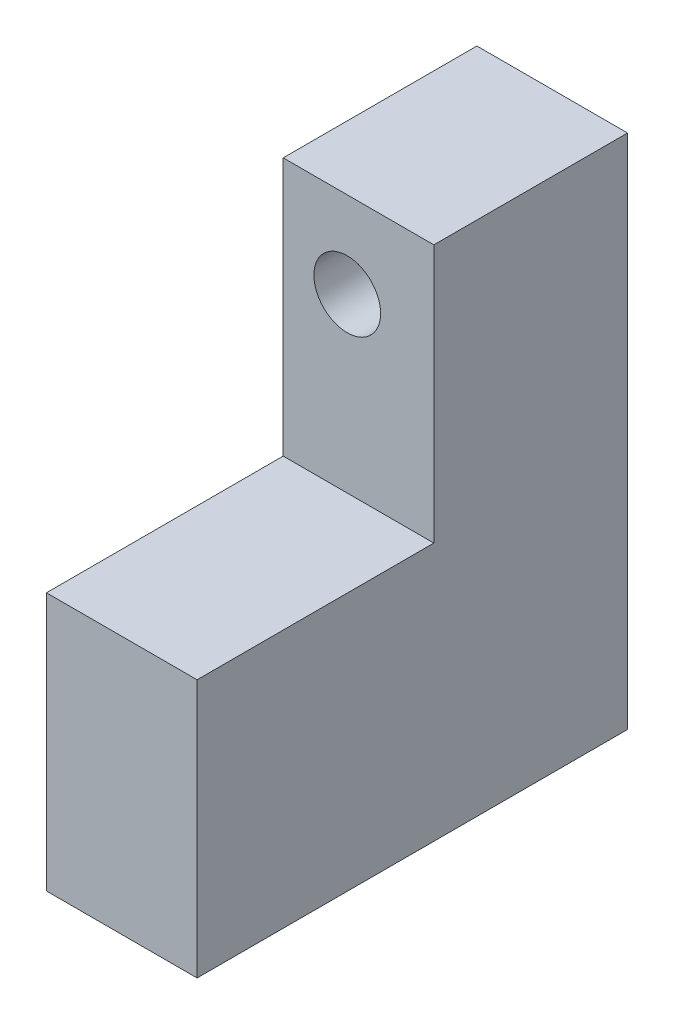
ISO-10303-21;
HEADER;
FILE_DESCRIPTION(('STEP AP214'),'2;1');
FILE_NAME('part.step','',(''),(''),'','','');
FILE_SCHEMA(('AUTOMOTIVE_DESIGN { 1 0 10303 214 1 1 1 1 }'));
ENDSEC;
DATA;
#1=APPLICATION_CONTEXT('core data for automotive mechanical design processes');
#2=APPLICATION_PROTOCOL_DEFINITION('international standard','automotive_design',2000,#1);
#3=PRODUCT_CONTEXT('',#1,'mechanical');
#4=PRODUCT('Part','Part','',(#3));
#5=PRODUCT_RELATED_PRODUCT_CATEGORY('part','',(#4));
#6=PRODUCT_DEFINITION_FORMATION('','',#4);
#7=PRODUCT_DEFINITION_CONTEXT('part definition',#1,'design');
#8=PRODUCT_DEFINITION('design','',#6,#7);
#9=PRODUCT_DEFINITION_SHAPE('','',#8);
#10=(LENGTH_UNIT() NAMED_UNIT(*) SI_UNIT(.MILLI.,.METRE.));
#11=(NAMED_UNIT(*) PLANE_ANGLE_UNIT() SI_UNIT($,.RADIAN.));
#12=(NAMED_UNIT(*) SI_UNIT($,.STERADIAN.) SOLID_ANGLE_UNIT());
#13=UNCERTAINTY_MEASURE_WITH_UNIT(LENGTH_MEASURE(1.E-05),#10,'distance_accuracy_value','');
#14=(GEOMETRIC_REPRESENTATION_CONTEXT(3) GLOBAL_UNCERTAINTY_ASSIGNED_CONTEXT((#13)) GLOBAL_UNIT_ASSIGNED_CONTEXT((#10,
#11,#12)) REPRESENTATION_CONTEXT('',''));
#15=CARTESIAN_POINT('',(0.,0.,0.));
#16=DIRECTION('',(0.,0.,1.));
#17=DIRECTION('',(1.,0.,0.));
#18=AXIS2_PLACEMENT_3D('',#15,#16,#17);
#19=CARTESIAN_POINT('',(0.,0.,9.));
#20=DIRECTION('',(0.,0.,-1.));
#21=DIRECTION('',(-1.,0.,0.));
#22=AXIS2_PLACEMENT_3D('',#19,#20,#21);
#23=PLANE('',#22);
#24=DIRECTION('',(0.,-1.,0.));
#25=VECTOR('',#24,1.);
#26=CARTESIAN_POINT('',(0.0250628144668974,28.5,9.));
#27=LINE('',#26,#25);
#28=CARTESIAN_POINT('',(0.0250628144668974,28.5,9.));
#29=VERTEX_POINT('',#28);
#30=CARTESIAN_POINT('',(0.0250628144668989,16.5,9.));
#31=VERTEX_POINT('',#30);
#32=EDGE_CURVE('E105',#29,#31,#27,.T.);
#33=ORIENTED_EDGE('',*,*,#32,.T.);
#34=DIRECTION('',(1.,0.,0.));
#35=VECTOR('',#34,1.);
#36=CARTESIAN_POINT('',(0.0250628144668989,16.5,9.));
#37=LINE('',#36,#35);
#38=CARTESIAN_POINT('',(7.0250628144669,16.5,9.));
#39=VERTEX_POINT('',#38);
#40=EDGE_CURVE('E137',#31,#39,#37,.T.);
#41=ORIENTED_EDGE('',*,*,#40,.T.);
#42=DIRECTION('',(0.,1.,0.));
#43=VECTOR('',#42,1.);
#44=CARTESIAN_POINT('',(7.0250628144669,28.5,9.));
#45=LINE('',#44,#43);
#46=CARTESIAN_POINT('',(7.0250628144669,28.5,9.));
#47=VERTEX_POINT('',#46);
#48=EDGE_CURVE('E95',#39,#47,#45,.T.);
#49=ORIENTED_EDGE('',*,*,#48,.T.);
#50=DIRECTION('',(-1.,0.,0.));
#51=VECTOR('',#50,1.);
#52=CARTESIAN_POINT('',(7.0250628144669,28.5,9.));
#53=LINE('',#52,#51);
#54=EDGE_CURVE('E63',#47,#29,#53,.T.);
#55=ORIENTED_EDGE('',*,*,#54,.T.);
#56=EDGE_LOOP('',(#33,#41,#49,#55));
#57=FACE_BOUND('',#56,.T.);
#58=CARTESIAN_POINT('',(3.,24.5,9.));
#59=DIRECTION('',(0.,0.,1.));
#60=DIRECTION('',(1.,0.,0.));
#61=AXIS2_PLACEMENT_3D('',#58,#59,#60);
#62=CIRCLE('',#61,1.55);
#63=CARTESIAN_POINT('',(4.55,24.5,9.));
#64=VERTEX_POINT('',#63);
#65=EDGE_CURVE('E110',#64,#64,#62,.T.);
#66=ORIENTED_EDGE('',*,*,#65,.F.);
#67=EDGE_LOOP('',(#66));
#68=FACE_BOUND('',#67,.T.);
#69=ADVANCED_FACE('F39',(#57,#68),#23,.F.);
#70=CARTESIAN_POINT('',(0.,0.,0.));
#71=DIRECTION('',(0.,0.,-1.));
#72=DIRECTION('',(-1.,0.,0.));
#73=AXIS2_PLACEMENT_3D('',#70,#71,#72);
#74=PLANE('',#73);
#75=DIRECTION('',(0.,1.,0.));
#76=VECTOR('',#75,1.);
#77=CARTESIAN_POINT('',(7.0250628144669,28.5,0.));
#78=LINE('',#77,#76);
#79=CARTESIAN_POINT('',(7.0250628144669,4.5,0.));
#80=VERTEX_POINT('',#79);
#81=CARTESIAN_POINT('',(7.0250628144669,28.5,0.));
#82=VERTEX_POINT('',#81);
#83=EDGE_CURVE('E102',#80,#82,#78,.T.);
#84=ORIENTED_EDGE('',*,*,#83,.F.);
#85=DIRECTION('',(1.,0.,0.));
#86=VECTOR('',#85,1.);
#87=CARTESIAN_POINT('',(7.0250628144669,4.5,0.));
#88=LINE('',#87,#86);
#89=CARTESIAN_POINT('',(0.0250628144669004,4.5,0.));
#90=VERTEX_POINT('',#89);
#91=EDGE_CURVE('E83',#90,#80,#88,.T.);
#92=ORIENTED_EDGE('',*,*,#91,.F.);
#93=DIRECTION('',(0.,-1.,0.));
#94=VECTOR('',#93,1.);
#95=CARTESIAN_POINT('',(0.0250628144668974,28.5,0.));
#96=LINE('',#95,#94);
#97=CARTESIAN_POINT('',(0.0250628144668974,28.5,0.));
#98=VERTEX_POINT('',#97);
#99=EDGE_CURVE('E96',#98,#90,#96,.T.);
#100=ORIENTED_EDGE('',*,*,#99,.F.);
#101=DIRECTION('',(-1.,0.,0.));
#102=VECTOR('',#101,1.);
#103=CARTESIAN_POINT('',(7.0250628144669,28.5,0.));
#104=LINE('',#103,#102);
#105=EDGE_CURVE('E109',#82,#98,#104,.T.);
#106=ORIENTED_EDGE('',*,*,#105,.F.);
#107=EDGE_LOOP('',(#84,#92,#100,#106));
#108=FACE_BOUND('',#107,.T.);
#109=CARTESIAN_POINT('',(3.,24.5,0.));
#110=DIRECTION('',(0.,0.,1.));
#111=DIRECTION('',(1.,0.,0.));
#112=AXIS2_PLACEMENT_3D('',#109,#110,#111);
#113=CIRCLE('',#112,1.55);
#114=CARTESIAN_POINT('',(4.55,24.5,0.));
#115=VERTEX_POINT('',#114);
#116=EDGE_CURVE('E114',#115,#115,#113,.T.);
#117=ORIENTED_EDGE('',*,*,#116,.T.);
#118=EDGE_LOOP('',(#117));
#119=FACE_BOUND('',#118,.T.);
#120=ADVANCED_FACE('F107',(#108,#119),#74,.T.);
#121=CARTESIAN_POINT('',(7.0250628144669,28.5,9.));
#122=DIRECTION('',(-1.,0.,0.));
#123=DIRECTION('',(0.,-1.,0.));
#124=AXIS2_PLACEMENT_3D('',#121,#122,#123);
#125=PLANE('',#124);
#126=ORIENTED_EDGE('',*,*,#83,.T.);
#127=DIRECTION('',(0.,0.,-1.));
#128=VECTOR('',#127,1.);
#129=CARTESIAN_POINT('',(7.0250628144669,28.5,9.));
#130=LINE('',#129,#128);
#131=EDGE_CURVE('E11',#47,#82,#130,.T.);
#132=ORIENTED_EDGE('',*,*,#131,.F.);
#133=ORIENTED_EDGE('',*,*,#48,.F.);
#134=DIRECTION('',(0.,0.,-1.));
#135=VECTOR('',#134,1.);
#136=CARTESIAN_POINT('',(7.0250628144669,16.5,20.));
#137=LINE('',#136,#135);
#138=CARTESIAN_POINT('',(7.0250628144669,16.5,20.));
#139=VERTEX_POINT('',#138);
#140=EDGE_CURVE('E54',#139,#39,#137,.T.);
#141=ORIENTED_EDGE('',*,*,#140,.F.);
#142=DIRECTION('',(0.,-1.,0.));
#143=VECTOR('',#142,1.);
#144=CARTESIAN_POINT('',(7.0250628144669,16.5,20.));
#145=LINE('',#144,#143);
#146=CARTESIAN_POINT('',(7.0250628144669,4.5,20.));
#147=VERTEX_POINT('',#146);
#148=EDGE_CURVE('E104',#139,#147,#145,.T.);
#149=ORIENTED_EDGE('',*,*,#148,.T.);
#150=DIRECTION('',(0.,0.,-1.));
#151=VECTOR('',#150,1.);
#152=CARTESIAN_POINT('',(7.0250628144669,4.5,9.));
#153=LINE('',#152,#151);
#154=EDGE_CURVE('E88',#147,#80,#153,.T.);
#155=ORIENTED_EDGE('',*,*,#154,.T.);
#156=EDGE_LOOP('',(#126,#132,#133,#141,#149,#155));
#157=FACE_BOUND('',#156,.T.);
#158=ADVANCED_FACE('F41',(#157),#125,.F.);
#159=CARTESIAN_POINT('',(7.0250628144669,28.5,9.));
#160=DIRECTION('',(0.,-1.,0.));
#161=DIRECTION('',(1.,0.,0.));
#162=AXIS2_PLACEMENT_3D('',#159,#160,#161);
#163=PLANE('',#162);
#164=ORIENTED_EDGE('',*,*,#105,.T.);
#165=DIRECTION('',(0.,0.,-1.));
#166=VECTOR('',#165,1.);
#167=CARTESIAN_POINT('',(0.0250628144668974,28.5,9.));
#168=LINE('',#167,#166);
#169=EDGE_CURVE('E47',#29,#98,#168,.T.);
#170=ORIENTED_EDGE('',*,*,#169,.F.);
#171=ORIENTED_EDGE('',*,*,#54,.F.);
#172=ORIENTED_EDGE('',*,*,#131,.T.);
#173=EDGE_LOOP('',(#164,#170,#171,#172));
#174=FACE_BOUND('',#173,.T.);
#175=ADVANCED_FACE('F126',(#174),#163,.F.);
#176=CARTESIAN_POINT('',(0.0250628144668974,28.5,9.));
#177=DIRECTION('',(1.,0.,0.));
#178=DIRECTION('',(0.,1.,0.));
#179=AXIS2_PLACEMENT_3D('',#176,#177,#178);
#180=PLANE('',#179);
#181=ORIENTED_EDGE('',*,*,#99,.T.);
#182=DIRECTION('',(0.,0.,-1.));
#183=VECTOR('',#182,1.);
#184=CARTESIAN_POINT('',(0.0250628144669004,4.5,9.));
#185=LINE('',#184,#183);
#186=CARTESIAN_POINT('',(0.0250628144668989,4.5,20.));
#187=VERTEX_POINT('',#186);
#188=EDGE_CURVE('E91',#187,#90,#185,.T.);
#189=ORIENTED_EDGE('',*,*,#188,.F.);
#190=DIRECTION('',(0.,-1.,0.));
#191=VECTOR('',#190,1.);
#192=CARTESIAN_POINT('',(0.0250628144668989,16.5,20.));
#193=LINE('',#192,#191);
#194=CARTESIAN_POINT('',(0.0250628144668989,16.5,20.));
#195=VERTEX_POINT('',#194);
#196=EDGE_CURVE('E136',#195,#187,#193,.T.);
#197=ORIENTED_EDGE('',*,*,#196,.F.);
#198=DIRECTION('',(0.,0.,-1.));
#199=VECTOR('',#198,1.);
#200=CARTESIAN_POINT('',(0.0250628144668989,16.5,20.));
#201=LINE('',#200,#199);
#202=EDGE_CURVE('E134',#195,#31,#201,.T.);
#203=ORIENTED_EDGE('',*,*,#202,.T.);
#204=ORIENTED_EDGE('',*,*,#32,.F.);
#205=ORIENTED_EDGE('',*,*,#169,.T.);
#206=EDGE_LOOP('',(#181,#189,#197,#203,#204,#205));
#207=FACE_BOUND('',#206,.T.);
#208=ADVANCED_FACE('F123',(#207),#180,.F.);
#209=CARTESIAN_POINT('',(7.0250628144669,4.5,9.));
#210=DIRECTION('',(0.,1.,0.));
#211=DIRECTION('',(-1.,0.,0.));
#212=AXIS2_PLACEMENT_3D('',#209,#210,#211);
#213=PLANE('',#212);
#214=CARTESIAN_POINT('',(3.5250628144669,4.5,5.));
#215=DIRECTION('',(0.,-1.,0.));
#216=DIRECTION('',(1.,0.,0.));
#217=AXIS2_PLACEMENT_3D('',#214,#215,#216);
#218=CIRCLE('',#217,1.55);
#219=CARTESIAN_POINT('',(5.0750628144669,4.5,5.));
#220=VERTEX_POINT('',#219);
#221=EDGE_CURVE('E153',#220,#220,#218,.T.);
#222=ORIENTED_EDGE('',*,*,#221,.F.);
#223=EDGE_LOOP('',(#222));
#224=FACE_BOUND('',#223,.T.);
#225=CARTESIAN_POINT('',(3.5250628144669,4.5,15.));
#226=DIRECTION('',(0.,-1.,0.));
#227=DIRECTION('',(1.,0.,0.));
#228=AXIS2_PLACEMENT_3D('',#225,#226,#227);
#229=CIRCLE('',#228,1.55);
#230=CARTESIAN_POINT('',(5.0750628144669,4.5,15.));
#231=VERTEX_POINT('',#230);
#232=EDGE_CURVE('E150',#231,#231,#229,.T.);
#233=ORIENTED_EDGE('',*,*,#232,.F.);
#234=EDGE_LOOP('',(#233));
#235=FACE_BOUND('',#234,.T.);
#236=ORIENTED_EDGE('',*,*,#91,.T.);
#237=ORIENTED_EDGE('',*,*,#154,.F.);
#238=DIRECTION('',(1.,0.,0.));
#239=VECTOR('',#238,1.);
#240=CARTESIAN_POINT('',(0.0250628144668989,4.5,20.));
#241=LINE('',#240,#239);
#242=EDGE_CURVE('E139',#187,#147,#241,.T.);
#243=ORIENTED_EDGE('',*,*,#242,.F.);
#244=ORIENTED_EDGE('',*,*,#188,.T.);
#245=EDGE_LOOP('',(#236,#237,#243,#244));
#246=FACE_BOUND('',#245,.T.);
#247=ADVANCED_FACE('F85',(#224,#235,#246),#213,.F.);
#248=CARTESIAN_POINT('',(3.,24.5,9.));
#249=DIRECTION('',(0.,0.,-1.));
#250=DIRECTION('',(-1.,0.,0.));
#251=AXIS2_PLACEMENT_3D('',#248,#249,#250);
#252=CYLINDRICAL_SURFACE('',#251,1.55);
#253=ORIENTED_EDGE('',*,*,#65,.T.);
#254=EDGE_LOOP('',(#253));
#255=FACE_BOUND('',#254,.T.);
#256=ORIENTED_EDGE('',*,*,#116,.F.);
#257=EDGE_LOOP('',(#256));
#258=FACE_BOUND('',#257,.T.);
#259=ADVANCED_FACE('F170',(#255,#258),#252,.F.);
#260=CARTESIAN_POINT('',(0.0250628144668989,16.5,20.));
#261=DIRECTION('',(0.,1.,0.));
#262=DIRECTION('',(-1.,0.,0.));
#263=AXIS2_PLACEMENT_3D('',#260,#261,#262);
#264=PLANE('',#263);
#265=ORIENTED_EDGE('',*,*,#40,.F.);
#266=ORIENTED_EDGE('',*,*,#202,.F.);
#267=DIRECTION('',(1.,0.,0.));
#268=VECTOR('',#267,1.);
#269=CARTESIAN_POINT('',(0.0250628144668989,16.5,20.));
#270=LINE('',#269,#268);
#271=EDGE_CURVE('E143',#195,#139,#270,.T.);
#272=ORIENTED_EDGE('',*,*,#271,.T.);
#273=ORIENTED_EDGE('',*,*,#140,.T.);
#274=EDGE_LOOP('',(#265,#266,#272,#273));
#275=FACE_BOUND('',#274,.T.);
#276=ADVANCED_FACE('F185',(#275),#264,.T.);
#277=CARTESIAN_POINT('',(0.,0.,20.));
#278=DIRECTION('',(0.,0.,-1.));
#279=DIRECTION('',(-1.,0.,0.));
#280=AXIS2_PLACEMENT_3D('',#277,#278,#279);
#281=PLANE('',#280);
#282=ORIENTED_EDGE('',*,*,#242,.T.);
#283=ORIENTED_EDGE('',*,*,#148,.F.);
#284=ORIENTED_EDGE('',*,*,#271,.F.);
#285=ORIENTED_EDGE('',*,*,#196,.T.);
#286=EDGE_LOOP('',(#282,#283,#284,#285));
#287=FACE_BOUND('',#286,.T.);
#288=ADVANCED_FACE('F176',(#287),#281,.F.);
#289=CARTESIAN_POINT('',(3.5250628144669,9.5,15.));
#290=DIRECTION('',(0.,-1.,0.));
#291=DIRECTION('',(1.,0.,0.));
#292=AXIS2_PLACEMENT_3D('',#289,#290,#291);
#293=CYLINDRICAL_SURFACE('',#292,1.55);
#294=CARTESIAN_POINT('',(3.5250628144669,9.5,15.));
#295=DIRECTION('',(0.,-1.,0.));
#296=DIRECTION('',(1.,0.,0.));
#297=AXIS2_PLACEMENT_3D('',#294,#295,#296);
#298=CIRCLE('',#297,1.55);
#299=CARTESIAN_POINT('',(5.0750628144669,9.5,15.));
#300=VERTEX_POINT('',#299);
#301=EDGE_CURVE('E147',#300,#300,#298,.T.);
#302=ORIENTED_EDGE('',*,*,#301,.F.);
#303=EDGE_LOOP('',(#302));
#304=FACE_BOUND('',#303,.T.);
#305=ORIENTED_EDGE('',*,*,#232,.T.);
#306=EDGE_LOOP('',(#305));
#307=FACE_BOUND('',#306,.T.);
#308=ADVANCED_FACE('F174',(#304,#307),#293,.F.);
#309=CARTESIAN_POINT('',(3.5250628144669,9.5,15.));
#310=DIRECTION('',(0.,-1.,0.));
#311=DIRECTION('',(1.,0.,0.));
#312=AXIS2_PLACEMENT_3D('',#309,#310,#311);
#313=PLANE('',#312);
#314=ORIENTED_EDGE('',*,*,#301,.T.);
#315=EDGE_LOOP('',(#314));
#316=FACE_BOUND('',#315,.T.);
#317=ADVANCED_FACE('F164',(#316),#313,.T.);
#318=CARTESIAN_POINT('',(3.5250628144669,9.5,5.));
#319=DIRECTION('',(0.,-1.,0.));
#320=DIRECTION('',(1.,0.,0.));
#321=AXIS2_PLACEMENT_3D('',#318,#319,#320);
#322=CYLINDRICAL_SURFACE('',#321,1.55);
#323=CARTESIAN_POINT('',(3.5250628144669,9.5,5.));
#324=DIRECTION('',(0.,-1.,0.));
#325=DIRECTION('',(1.,0.,0.));
#326=AXIS2_PLACEMENT_3D('',#323,#324,#325);
#327=CIRCLE('',#326,1.55);
#328=CARTESIAN_POINT('',(5.0750628144669,9.5,5.));
#329=VERTEX_POINT('',#328);
#330=EDGE_CURVE('E140',#329,#329,#327,.T.);
#331=ORIENTED_EDGE('',*,*,#330,.F.);
#332=EDGE_LOOP('',(#331));
#333=FACE_BOUND('',#332,.T.);
#334=ORIENTED_EDGE('',*,*,#221,.T.);
#335=EDGE_LOOP('',(#334));
#336=FACE_BOUND('',#335,.T.);
#337=ADVANCED_FACE('F161',(#333,#336),#322,.F.);
#338=CARTESIAN_POINT('',(3.5250628144669,9.5,5.));
#339=DIRECTION('',(0.,-1.,0.));
#340=DIRECTION('',(1.,0.,0.));
#341=AXIS2_PLACEMENT_3D('',#338,#339,#340);
#342=PLANE('',#341);
#343=ORIENTED_EDGE('',*,*,#330,.T.);
#344=EDGE_LOOP('',(#343));
#345=FACE_BOUND('',#344,.T.);
#346=ADVANCED_FACE('F159',(#345),#342,.T.);
#347=CLOSED_SHELL('',(#69,#120,#158,#175,#208,#247,#259,#276,#288,#308,#317,#337,#346));
#348=MANIFOLD_SOLID_BREP('B2',#347);
#349=ADVANCED_BREP_SHAPE_REPRESENTATION('',(#18,#348),#14);
#350=SHAPE_DEFINITION_REPRESENTATION(#9,#349);
ENDSEC;
END-ISO-10303-21;
